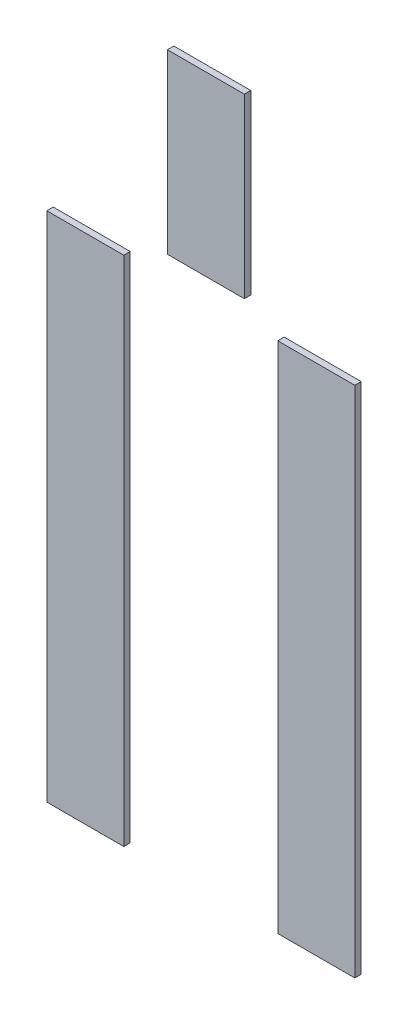
ISO-10303-21;
HEADER;
FILE_DESCRIPTION(('STEP AP214'),'2;1');
FILE_NAME('part.step','',(''),(''),'','','');
FILE_SCHEMA(('AUTOMOTIVE_DESIGN { 1 0 10303 214 1 1 1 1 }'));
ENDSEC;
DATA;
#1=APPLICATION_CONTEXT('core data for automotive mechanical design processes');
#2=APPLICATION_PROTOCOL_DEFINITION('international standard','automotive_design',2000,#1);
#3=PRODUCT_CONTEXT('',#1,'mechanical');
#4=PRODUCT('Part','Part','',(#3));
#5=PRODUCT_RELATED_PRODUCT_CATEGORY('part','',(#4));
#6=PRODUCT_DEFINITION_FORMATION('','',#4);
#7=PRODUCT_DEFINITION_CONTEXT('part definition',#1,'design');
#8=PRODUCT_DEFINITION('design','',#6,#7);
#9=PRODUCT_DEFINITION_SHAPE('','',#8);
#10=(LENGTH_UNIT() NAMED_UNIT(*) SI_UNIT(.MILLI.,.METRE.));
#11=(NAMED_UNIT(*) PLANE_ANGLE_UNIT() SI_UNIT($,.RADIAN.));
#12=(NAMED_UNIT(*) SI_UNIT($,.STERADIAN.) SOLID_ANGLE_UNIT());
#13=UNCERTAINTY_MEASURE_WITH_UNIT(LENGTH_MEASURE(1.E-05),#10,'distance_accuracy_value','');
#14=(GEOMETRIC_REPRESENTATION_CONTEXT(3) GLOBAL_UNCERTAINTY_ASSIGNED_CONTEXT((#13)) GLOBAL_UNIT_ASSIGNED_CONTEXT((#10,
#11,#12)) REPRESENTATION_CONTEXT('',''));
#15=CARTESIAN_POINT('',(0.,0.,0.));
#16=DIRECTION('',(0.,0.,1.));
#17=DIRECTION('',(1.,0.,0.));
#18=AXIS2_PLACEMENT_3D('',#15,#16,#17);
#19=CARTESIAN_POINT('',(-128.870529064363,741.864249999427,10.));
#20=DIRECTION('',(1.,0.,0.));
#21=DIRECTION('',(0.,0.,-1.));
#22=AXIS2_PLACEMENT_3D('',#19,#20,#21);
#23=PLANE('',#22);
#24=DIRECTION('',(0.,-1.,0.));
#25=VECTOR('',#24,1.);
#26=CARTESIAN_POINT('',(-128.870529064363,741.864249999427,0.));
#27=LINE('',#26,#25);
#28=CARTESIAN_POINT('',(-128.870529064363,741.864249999427,0.));
#29=VERTEX_POINT('',#28);
#30=CARTESIAN_POINT('',(-128.870529064363,465.760435553572,0.));
#31=VERTEX_POINT('',#30);
#32=EDGE_CURVE('E107',#29,#31,#27,.T.);
#33=ORIENTED_EDGE('',*,*,#32,.T.);
#34=DIRECTION('',(0.,0.,-1.));
#35=VECTOR('',#34,1.);
#36=CARTESIAN_POINT('',(-128.870529064363,465.760435553572,10.));
#37=LINE('',#36,#35);
#38=CARTESIAN_POINT('',(-128.870529064363,465.760435553572,10.));
#39=VERTEX_POINT('',#38);
#40=EDGE_CURVE('E12',#39,#31,#37,.T.);
#41=ORIENTED_EDGE('',*,*,#40,.F.);
#42=DIRECTION('',(0.,-1.,0.));
#43=VECTOR('',#42,1.);
#44=CARTESIAN_POINT('',(-128.870529064363,741.864249999427,10.));
#45=LINE('',#44,#43);
#46=CARTESIAN_POINT('',(-128.870529064363,741.864249999427,10.));
#47=VERTEX_POINT('',#46);
#48=EDGE_CURVE('E95',#47,#39,#45,.T.);
#49=ORIENTED_EDGE('',*,*,#48,.F.);
#50=DIRECTION('',(0.,0.,-1.));
#51=VECTOR('',#50,1.);
#52=CARTESIAN_POINT('',(-128.870529064363,741.864249999427,10.));
#53=LINE('',#52,#51);
#54=EDGE_CURVE('E103',#47,#29,#53,.T.);
#55=ORIENTED_EDGE('',*,*,#54,.T.);
#56=EDGE_LOOP('',(#33,#41,#49,#55));
#57=FACE_BOUND('',#56,.T.);
#58=ADVANCED_FACE('F44',(#57),#23,.F.);
#59=CARTESIAN_POINT('',(-128.870529064363,465.760435553572,10.));
#60=DIRECTION('',(0.,1.,0.));
#61=DIRECTION('',(0.,0.,1.));
#62=AXIS2_PLACEMENT_3D('',#59,#60,#61);
#63=PLANE('',#62);
#64=DIRECTION('',(1.,0.,0.));
#65=VECTOR('',#64,1.);
#66=CARTESIAN_POINT('',(-128.870529064363,465.760435553572,0.));
#67=LINE('',#66,#65);
#68=CARTESIAN_POINT('',(-8.87052906436281,465.760435553572,0.));
#69=VERTEX_POINT('',#68);
#70=EDGE_CURVE('E99',#31,#69,#67,.T.);
#71=ORIENTED_EDGE('',*,*,#70,.T.);
#72=DIRECTION('',(0.,0.,-1.));
#73=VECTOR('',#72,1.);
#74=CARTESIAN_POINT('',(-8.87052906436281,465.760435553572,10.));
#75=LINE('',#74,#73);
#76=CARTESIAN_POINT('',(-8.87052906436281,465.760435553572,10.));
#77=VERTEX_POINT('',#76);
#78=EDGE_CURVE('E52',#77,#69,#75,.T.);
#79=ORIENTED_EDGE('',*,*,#78,.F.);
#80=DIRECTION('',(1.,0.,0.));
#81=VECTOR('',#80,1.);
#82=CARTESIAN_POINT('',(-128.870529064363,465.760435553572,10.));
#83=LINE('',#82,#81);
#84=EDGE_CURVE('E90',#39,#77,#83,.T.);
#85=ORIENTED_EDGE('',*,*,#84,.F.);
#86=ORIENTED_EDGE('',*,*,#40,.T.);
#87=EDGE_LOOP('',(#71,#79,#85,#86));
#88=FACE_BOUND('',#87,.T.);
#89=ADVANCED_FACE('F98',(#88),#63,.F.);
#90=CARTESIAN_POINT('',(-8.8705290643628,741.864249999427,10.));
#91=DIRECTION('',(-1.,0.,0.));
#92=DIRECTION('',(0.,-1.,0.));
#93=AXIS2_PLACEMENT_3D('',#90,#91,#92);
#94=PLANE('',#93);
#95=DIRECTION('',(0.,1.,0.));
#96=VECTOR('',#95,1.);
#97=CARTESIAN_POINT('',(-8.8705290643628,741.864249999427,0.));
#98=LINE('',#97,#96);
#99=CARTESIAN_POINT('',(-8.8705290643628,741.864249999427,0.));
#100=VERTEX_POINT('',#99);
#101=EDGE_CURVE('E77',#69,#100,#98,.T.);
#102=ORIENTED_EDGE('',*,*,#101,.T.);
#103=DIRECTION('',(0.,0.,-1.));
#104=VECTOR('',#103,1.);
#105=CARTESIAN_POINT('',(-8.8705290643628,741.864249999427,10.));
#106=LINE('',#105,#104);
#107=CARTESIAN_POINT('',(-8.8705290643628,741.864249999427,10.));
#108=VERTEX_POINT('',#107);
#109=EDGE_CURVE('E100',#108,#100,#106,.T.);
#110=ORIENTED_EDGE('',*,*,#109,.F.);
#111=DIRECTION('',(0.,1.,0.));
#112=VECTOR('',#111,1.);
#113=CARTESIAN_POINT('',(-8.8705290643628,741.864249999427,10.));
#114=LINE('',#113,#112);
#115=EDGE_CURVE('E93',#77,#108,#114,.T.);
#116=ORIENTED_EDGE('',*,*,#115,.F.);
#117=ORIENTED_EDGE('',*,*,#78,.T.);
#118=EDGE_LOOP('',(#102,#110,#116,#117));
#119=FACE_BOUND('',#118,.T.);
#120=ADVANCED_FACE('F101',(#119),#94,.F.);
#121=CARTESIAN_POINT('',(-128.870529064363,741.864249999427,10.));
#122=DIRECTION('',(0.,-1.,0.));
#123=DIRECTION('',(0.,0.,-1.));
#124=AXIS2_PLACEMENT_3D('',#121,#122,#123);
#125=PLANE('',#124);
#126=DIRECTION('',(-1.,0.,0.));
#127=VECTOR('',#126,1.);
#128=CARTESIAN_POINT('',(-128.870529064363,741.864249999427,0.));
#129=LINE('',#128,#127);
#130=EDGE_CURVE('E83',#100,#29,#129,.T.);
#131=ORIENTED_EDGE('',*,*,#130,.T.);
#132=ORIENTED_EDGE('',*,*,#54,.F.);
#133=DIRECTION('',(-1.,0.,0.));
#134=VECTOR('',#133,1.);
#135=CARTESIAN_POINT('',(-128.870529064363,741.864249999427,10.));
#136=LINE('',#135,#134);
#137=EDGE_CURVE('E60',#108,#47,#136,.T.);
#138=ORIENTED_EDGE('',*,*,#137,.F.);
#139=ORIENTED_EDGE('',*,*,#109,.T.);
#140=EDGE_LOOP('',(#131,#132,#138,#139));
#141=FACE_BOUND('',#140,.T.);
#142=ADVANCED_FACE('F114',(#141),#125,.F.);
#143=CARTESIAN_POINT('',(0.,0.,10.));
#144=DIRECTION('',(0.,0.,1.));
#145=DIRECTION('',(1.,0.,0.));
#146=AXIS2_PLACEMENT_3D('',#143,#144,#145);
#147=PLANE('',#146);
#148=ORIENTED_EDGE('',*,*,#48,.T.);
#149=ORIENTED_EDGE('',*,*,#84,.T.);
#150=ORIENTED_EDGE('',*,*,#115,.T.);
#151=ORIENTED_EDGE('',*,*,#137,.T.);
#152=EDGE_LOOP('',(#148,#149,#150,#151));
#153=FACE_BOUND('',#152,.T.);
#154=ADVANCED_FACE('F91',(#153),#147,.T.);
#155=CARTESIAN_POINT('',(0.,0.,0.));
#156=DIRECTION('',(0.,0.,1.));
#157=DIRECTION('',(1.,0.,0.));
#158=AXIS2_PLACEMENT_3D('',#155,#156,#157);
#159=PLANE('',#158);
#160=ORIENTED_EDGE('',*,*,#32,.F.);
#161=ORIENTED_EDGE('',*,*,#130,.F.);
#162=ORIENTED_EDGE('',*,*,#101,.F.);
#163=ORIENTED_EDGE('',*,*,#70,.F.);
#164=EDGE_LOOP('',(#160,#161,#162,#163));
#165=FACE_BOUND('',#164,.T.);
#166=ADVANCED_FACE('F117',(#165),#159,.F.);
#167=CLOSED_SHELL('',(#58,#89,#120,#142,#154,#166));
#168=MANIFOLD_SOLID_BREP('B2',#167);
#169=CARTESIAN_POINT('',(43.2291027956546,435.023040595247,10.));
#170=DIRECTION('',(1.,0.,0.));
#171=DIRECTION('',(0.,1.,0.));
#172=AXIS2_PLACEMENT_3D('',#169,#170,#171);
#173=PLANE('',#172);
#174=DIRECTION('',(0.,-1.,0.));
#175=VECTOR('',#174,1.);
#176=CARTESIAN_POINT('',(43.2291027956546,435.023040595247,0.));
#177=LINE('',#176,#175);
#178=CARTESIAN_POINT('',(43.2291027956546,435.023040595247,0.));
#179=VERTEX_POINT('',#178);
#180=CARTESIAN_POINT('',(43.2291027956547,-364.976959404753,0.));
#181=VERTEX_POINT('',#180);
#182=EDGE_CURVE('E240',#179,#181,#177,.T.);
#183=ORIENTED_EDGE('',*,*,#182,.T.);
#184=DIRECTION('',(0.,0.,-1.));
#185=VECTOR('',#184,1.);
#186=CARTESIAN_POINT('',(43.2291027956547,-364.976959404753,10.));
#187=LINE('',#186,#185);
#188=CARTESIAN_POINT('',(43.2291027956547,-364.976959404753,10.));
#189=VERTEX_POINT('',#188);
#190=EDGE_CURVE('E42',#189,#181,#187,.T.);
#191=ORIENTED_EDGE('',*,*,#190,.F.);
#192=DIRECTION('',(0.,-1.,0.));
#193=VECTOR('',#192,1.);
#194=CARTESIAN_POINT('',(43.2291027956546,435.023040595247,10.));
#195=LINE('',#194,#193);
#196=CARTESIAN_POINT('',(43.2291027956546,435.023040595247,10.));
#197=VERTEX_POINT('',#196);
#198=EDGE_CURVE('E228',#197,#189,#195,.T.);
#199=ORIENTED_EDGE('',*,*,#198,.F.);
#200=DIRECTION('',(0.,0.,-1.));
#201=VECTOR('',#200,1.);
#202=CARTESIAN_POINT('',(43.2291027956546,435.023040595247,10.));
#203=LINE('',#202,#201);
#204=EDGE_CURVE('E236',#197,#179,#203,.T.);
#205=ORIENTED_EDGE('',*,*,#204,.T.);
#206=EDGE_LOOP('',(#183,#191,#199,#205));
#207=FACE_BOUND('',#206,.T.);
#208=ADVANCED_FACE('F177',(#207),#173,.F.);
#209=CARTESIAN_POINT('',(43.2291027956547,-364.976959404753,10.));
#210=DIRECTION('',(0.,1.,0.));
#211=DIRECTION('',(0.,0.,1.));
#212=AXIS2_PLACEMENT_3D('',#209,#210,#211);
#213=PLANE('',#212);
#214=DIRECTION('',(1.,0.,0.));
#215=VECTOR('',#214,1.);
#216=CARTESIAN_POINT('',(43.2291027956547,-364.976959404753,0.));
#217=LINE('',#216,#215);
#218=CARTESIAN_POINT('',(163.229102795655,-364.976959404753,0.));
#219=VERTEX_POINT('',#218);
#220=EDGE_CURVE('E232',#181,#219,#217,.T.);
#221=ORIENTED_EDGE('',*,*,#220,.T.);
#222=DIRECTION('',(0.,0.,-1.));
#223=VECTOR('',#222,1.);
#224=CARTESIAN_POINT('',(163.229102795655,-364.976959404753,10.));
#225=LINE('',#224,#223);
#226=CARTESIAN_POINT('',(163.229102795655,-364.976959404753,10.));
#227=VERTEX_POINT('',#226);
#228=EDGE_CURVE('E185',#227,#219,#225,.T.);
#229=ORIENTED_EDGE('',*,*,#228,.F.);
#230=DIRECTION('',(1.,0.,0.));
#231=VECTOR('',#230,1.);
#232=CARTESIAN_POINT('',(43.2291027956547,-364.976959404753,10.));
#233=LINE('',#232,#231);
#234=EDGE_CURVE('E223',#189,#227,#233,.T.);
#235=ORIENTED_EDGE('',*,*,#234,.F.);
#236=ORIENTED_EDGE('',*,*,#190,.T.);
#237=EDGE_LOOP('',(#221,#229,#235,#236));
#238=FACE_BOUND('',#237,.T.);
#239=ADVANCED_FACE('F231',(#238),#213,.F.);
#240=CARTESIAN_POINT('',(163.229102795655,435.023040595247,10.));
#241=DIRECTION('',(-1.,0.,0.));
#242=DIRECTION('',(0.,-1.,0.));
#243=AXIS2_PLACEMENT_3D('',#240,#241,#242);
#244=PLANE('',#243);
#245=DIRECTION('',(0.,1.,0.));
#246=VECTOR('',#245,1.);
#247=CARTESIAN_POINT('',(163.229102795655,435.023040595247,0.));
#248=LINE('',#247,#246);
#249=CARTESIAN_POINT('',(163.229102795655,435.023040595247,0.));
#250=VERTEX_POINT('',#249);
#251=EDGE_CURVE('E210',#219,#250,#248,.T.);
#252=ORIENTED_EDGE('',*,*,#251,.T.);
#253=DIRECTION('',(0.,0.,-1.));
#254=VECTOR('',#253,1.);
#255=CARTESIAN_POINT('',(163.229102795655,435.023040595247,10.));
#256=LINE('',#255,#254);
#257=CARTESIAN_POINT('',(163.229102795655,435.023040595247,10.));
#258=VERTEX_POINT('',#257);
#259=EDGE_CURVE('E233',#258,#250,#256,.T.);
#260=ORIENTED_EDGE('',*,*,#259,.F.);
#261=DIRECTION('',(0.,1.,0.));
#262=VECTOR('',#261,1.);
#263=CARTESIAN_POINT('',(163.229102795655,435.023040595247,10.));
#264=LINE('',#263,#262);
#265=EDGE_CURVE('E226',#227,#258,#264,.T.);
#266=ORIENTED_EDGE('',*,*,#265,.F.);
#267=ORIENTED_EDGE('',*,*,#228,.T.);
#268=EDGE_LOOP('',(#252,#260,#266,#267));
#269=FACE_BOUND('',#268,.T.);
#270=ADVANCED_FACE('F234',(#269),#244,.F.);
#271=CARTESIAN_POINT('',(43.2291027956546,435.023040595247,10.));
#272=DIRECTION('',(0.,-1.,0.));
#273=DIRECTION('',(0.,0.,-1.));
#274=AXIS2_PLACEMENT_3D('',#271,#272,#273);
#275=PLANE('',#274);
#276=DIRECTION('',(-1.,0.,0.));
#277=VECTOR('',#276,1.);
#278=CARTESIAN_POINT('',(43.2291027956546,435.023040595247,0.));
#279=LINE('',#278,#277);
#280=EDGE_CURVE('E216',#250,#179,#279,.T.);
#281=ORIENTED_EDGE('',*,*,#280,.T.);
#282=ORIENTED_EDGE('',*,*,#204,.F.);
#283=DIRECTION('',(-1.,0.,0.));
#284=VECTOR('',#283,1.);
#285=CARTESIAN_POINT('',(43.2291027956546,435.023040595247,10.));
#286=LINE('',#285,#284);
#287=EDGE_CURVE('E193',#258,#197,#286,.T.);
#288=ORIENTED_EDGE('',*,*,#287,.F.);
#289=ORIENTED_EDGE('',*,*,#259,.T.);
#290=EDGE_LOOP('',(#281,#282,#288,#289));
#291=FACE_BOUND('',#290,.T.);
#292=ADVANCED_FACE('F247',(#291),#275,.F.);
#293=CARTESIAN_POINT('',(0.,0.,10.));
#294=DIRECTION('',(0.,0.,1.));
#295=DIRECTION('',(1.,0.,0.));
#296=AXIS2_PLACEMENT_3D('',#293,#294,#295);
#297=PLANE('',#296);
#298=ORIENTED_EDGE('',*,*,#198,.T.);
#299=ORIENTED_EDGE('',*,*,#234,.T.);
#300=ORIENTED_EDGE('',*,*,#265,.T.);
#301=ORIENTED_EDGE('',*,*,#287,.T.);
#302=EDGE_LOOP('',(#298,#299,#300,#301));
#303=FACE_BOUND('',#302,.T.);
#304=ADVANCED_FACE('F224',(#303),#297,.T.);
#305=CARTESIAN_POINT('',(0.,0.,0.));
#306=DIRECTION('',(0.,0.,1.));
#307=DIRECTION('',(1.,0.,0.));
#308=AXIS2_PLACEMENT_3D('',#305,#306,#307);
#309=PLANE('',#308);
#310=ORIENTED_EDGE('',*,*,#182,.F.);
#311=ORIENTED_EDGE('',*,*,#280,.F.);
#312=ORIENTED_EDGE('',*,*,#251,.F.);
#313=ORIENTED_EDGE('',*,*,#220,.F.);
#314=EDGE_LOOP('',(#310,#311,#312,#313));
#315=FACE_BOUND('',#314,.T.);
#316=ADVANCED_FACE('F250',(#315),#309,.F.);
#317=CLOSED_SHELL('',(#208,#239,#270,#292,#304,#316));
#318=MANIFOLD_SOLID_BREP('B6',#317);
#319=CARTESIAN_POINT('',(-316.81756221963,430.562892583866,10.));
#320=DIRECTION('',(1.,0.,0.));
#321=DIRECTION('',(0.,1.,0.));
#322=AXIS2_PLACEMENT_3D('',#319,#320,#321);
#323=PLANE('',#322);
#324=DIRECTION('',(0.,-1.,0.));
#325=VECTOR('',#324,1.);
#326=CARTESIAN_POINT('',(-316.81756221963,430.562892583866,0.));
#327=LINE('',#326,#325);
#328=CARTESIAN_POINT('',(-316.81756221963,430.562892583866,0.));
#329=VERTEX_POINT('',#328);
#330=CARTESIAN_POINT('',(-316.81756221963,-367.596407837066,0.));
#331=VERTEX_POINT('',#330);
#332=EDGE_CURVE('E364',#329,#331,#327,.T.);
#333=ORIENTED_EDGE('',*,*,#332,.T.);
#334=DIRECTION('',(0.,0.,-1.));
#335=VECTOR('',#334,1.);
#336=CARTESIAN_POINT('',(-316.81756221963,-367.596407837066,10.));
#337=LINE('',#336,#335);
#338=CARTESIAN_POINT('',(-316.81756221963,-367.596407837066,10.));
#339=VERTEX_POINT('',#338);
#340=EDGE_CURVE('E175',#339,#331,#337,.T.);
#341=ORIENTED_EDGE('',*,*,#340,.F.);
#342=DIRECTION('',(0.,-1.,0.));
#343=VECTOR('',#342,1.);
#344=CARTESIAN_POINT('',(-316.81756221963,430.562892583866,10.));
#345=LINE('',#344,#343);
#346=CARTESIAN_POINT('',(-316.81756221963,430.562892583866,10.));
#347=VERTEX_POINT('',#346);
#348=EDGE_CURVE('E352',#347,#339,#345,.T.);
#349=ORIENTED_EDGE('',*,*,#348,.F.);
#350=DIRECTION('',(0.,0.,-1.));
#351=VECTOR('',#350,1.);
#352=CARTESIAN_POINT('',(-316.81756221963,430.562892583866,10.));
#353=LINE('',#352,#351);
#354=EDGE_CURVE('E360',#347,#329,#353,.T.);
#355=ORIENTED_EDGE('',*,*,#354,.T.);
#356=EDGE_LOOP('',(#333,#341,#349,#355));
#357=FACE_BOUND('',#356,.T.);
#358=ADVANCED_FACE('F301',(#357),#323,.F.);
#359=CARTESIAN_POINT('',(-316.81756221963,-367.596407837066,10.));
#360=DIRECTION('',(0.,1.,0.));
#361=DIRECTION('',(0.,0.,1.));
#362=AXIS2_PLACEMENT_3D('',#359,#360,#361);
#363=PLANE('',#362);
#364=DIRECTION('',(1.,0.,0.));
#365=VECTOR('',#364,1.);
#366=CARTESIAN_POINT('',(-316.81756221963,-367.596407837066,0.));
#367=LINE('',#366,#365);
#368=CARTESIAN_POINT('',(-196.81756221963,-367.596407837066,0.));
#369=VERTEX_POINT('',#368);
#370=EDGE_CURVE('E356',#331,#369,#367,.T.);
#371=ORIENTED_EDGE('',*,*,#370,.T.);
#372=DIRECTION('',(0.,0.,-1.));
#373=VECTOR('',#372,1.);
#374=CARTESIAN_POINT('',(-196.81756221963,-367.596407837066,10.));
#375=LINE('',#374,#373);
#376=CARTESIAN_POINT('',(-196.81756221963,-367.596407837066,10.));
#377=VERTEX_POINT('',#376);
#378=EDGE_CURVE('E309',#377,#369,#375,.T.);
#379=ORIENTED_EDGE('',*,*,#378,.F.);
#380=DIRECTION('',(1.,0.,0.));
#381=VECTOR('',#380,1.);
#382=CARTESIAN_POINT('',(-316.81756221963,-367.596407837066,10.));
#383=LINE('',#382,#381);
#384=EDGE_CURVE('E347',#339,#377,#383,.T.);
#385=ORIENTED_EDGE('',*,*,#384,.F.);
#386=ORIENTED_EDGE('',*,*,#340,.T.);
#387=EDGE_LOOP('',(#371,#379,#385,#386));
#388=FACE_BOUND('',#387,.T.);
#389=ADVANCED_FACE('F355',(#388),#363,.F.);
#390=CARTESIAN_POINT('',(-196.81756221963,430.562892583866,10.));
#391=DIRECTION('',(-1.,0.,0.));
#392=DIRECTION('',(0.,-1.,0.));
#393=AXIS2_PLACEMENT_3D('',#390,#391,#392);
#394=PLANE('',#393);
#395=DIRECTION('',(0.,1.,0.));
#396=VECTOR('',#395,1.);
#397=CARTESIAN_POINT('',(-196.81756221963,430.562892583866,0.));
#398=LINE('',#397,#396);
#399=CARTESIAN_POINT('',(-196.81756221963,430.562892583866,0.));
#400=VERTEX_POINT('',#399);
#401=EDGE_CURVE('E334',#369,#400,#398,.T.);
#402=ORIENTED_EDGE('',*,*,#401,.T.);
#403=DIRECTION('',(0.,0.,-1.));
#404=VECTOR('',#403,1.);
#405=CARTESIAN_POINT('',(-196.81756221963,430.562892583866,10.));
#406=LINE('',#405,#404);
#407=CARTESIAN_POINT('',(-196.81756221963,430.562892583866,10.));
#408=VERTEX_POINT('',#407);
#409=EDGE_CURVE('E357',#408,#400,#406,.T.);
#410=ORIENTED_EDGE('',*,*,#409,.F.);
#411=DIRECTION('',(0.,1.,0.));
#412=VECTOR('',#411,1.);
#413=CARTESIAN_POINT('',(-196.81756221963,430.562892583866,10.));
#414=LINE('',#413,#412);
#415=EDGE_CURVE('E350',#377,#408,#414,.T.);
#416=ORIENTED_EDGE('',*,*,#415,.F.);
#417=ORIENTED_EDGE('',*,*,#378,.T.);
#418=EDGE_LOOP('',(#402,#410,#416,#417));
#419=FACE_BOUND('',#418,.T.);
#420=ADVANCED_FACE('F358',(#419),#394,.F.);
#421=CARTESIAN_POINT('',(-316.81756221963,430.562892583866,10.));
#422=DIRECTION('',(0.,-1.,0.));
#423=DIRECTION('',(0.,0.,-1.));
#424=AXIS2_PLACEMENT_3D('',#421,#422,#423);
#425=PLANE('',#424);
#426=DIRECTION('',(-1.,0.,0.));
#427=VECTOR('',#426,1.);
#428=CARTESIAN_POINT('',(-316.81756221963,430.562892583866,0.));
#429=LINE('',#428,#427);
#430=EDGE_CURVE('E340',#400,#329,#429,.T.);
#431=ORIENTED_EDGE('',*,*,#430,.T.);
#432=ORIENTED_EDGE('',*,*,#354,.F.);
#433=DIRECTION('',(-1.,0.,0.));
#434=VECTOR('',#433,1.);
#435=CARTESIAN_POINT('',(-316.81756221963,430.562892583866,10.));
#436=LINE('',#435,#434);
#437=EDGE_CURVE('E317',#408,#347,#436,.T.);
#438=ORIENTED_EDGE('',*,*,#437,.F.);
#439=ORIENTED_EDGE('',*,*,#409,.T.);
#440=EDGE_LOOP('',(#431,#432,#438,#439));
#441=FACE_BOUND('',#440,.T.);
#442=ADVANCED_FACE('F371',(#441),#425,.F.);
#443=CARTESIAN_POINT('',(0.,0.,10.));
#444=DIRECTION('',(0.,0.,1.));
#445=DIRECTION('',(1.,0.,0.));
#446=AXIS2_PLACEMENT_3D('',#443,#444,#445);
#447=PLANE('',#446);
#448=ORIENTED_EDGE('',*,*,#348,.T.);
#449=ORIENTED_EDGE('',*,*,#384,.T.);
#450=ORIENTED_EDGE('',*,*,#415,.T.);
#451=ORIENTED_EDGE('',*,*,#437,.T.);
#452=EDGE_LOOP('',(#448,#449,#450,#451));
#453=FACE_BOUND('',#452,.T.);
#454=ADVANCED_FACE('F348',(#453),#447,.T.);
#455=CARTESIAN_POINT('',(0.,0.,0.));
#456=DIRECTION('',(0.,0.,1.));
#457=DIRECTION('',(1.,0.,0.));
#458=AXIS2_PLACEMENT_3D('',#455,#456,#457);
#459=PLANE('',#458);
#460=ORIENTED_EDGE('',*,*,#332,.F.);
#461=ORIENTED_EDGE('',*,*,#430,.F.);
#462=ORIENTED_EDGE('',*,*,#401,.F.);
#463=ORIENTED_EDGE('',*,*,#370,.F.);
#464=EDGE_LOOP('',(#460,#461,#462,#463));
#465=FACE_BOUND('',#464,.T.);
#466=ADVANCED_FACE('F374',(#465),#459,.F.);
#467=CLOSED_SHELL('',(#358,#389,#420,#442,#454,#466));
#468=MANIFOLD_SOLID_BREP('B36',#467);
#469=ADVANCED_BREP_SHAPE_REPRESENTATION('',(#18,#168,#318,#468),#14);
#470=SHAPE_DEFINITION_REPRESENTATION(#9,#469);
ENDSEC;
END-ISO-10303-21;
